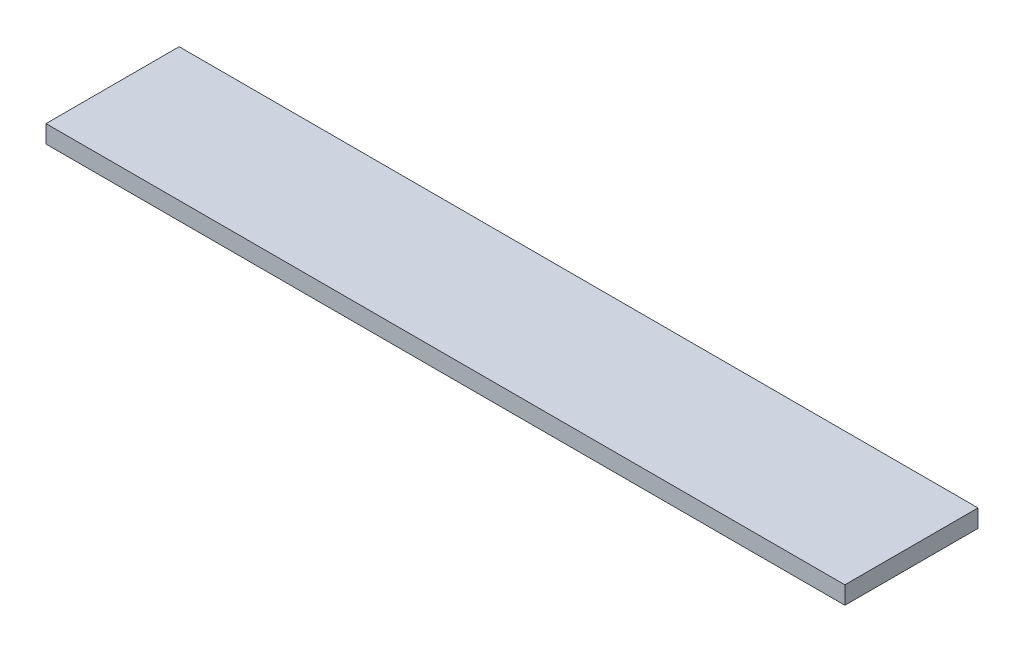
ISO-10303-21;
HEADER;
FILE_DESCRIPTION(('STEP AP214'),'2;1');
FILE_NAME('part.step','',(''),(''),'','','');
FILE_SCHEMA(('AUTOMOTIVE_DESIGN { 1 0 10303 214 1 1 1 1 }'));
ENDSEC;
DATA;
#1=APPLICATION_CONTEXT('core data for automotive mechanical design processes');
#2=APPLICATION_PROTOCOL_DEFINITION('international standard','automotive_design',2000,#1);
#3=PRODUCT_CONTEXT('',#1,'mechanical');
#4=PRODUCT('Part','Part','',(#3));
#5=PRODUCT_RELATED_PRODUCT_CATEGORY('part','',(#4));
#6=PRODUCT_DEFINITION_FORMATION('','',#4);
#7=PRODUCT_DEFINITION_CONTEXT('part definition',#1,'design');
#8=PRODUCT_DEFINITION('design','',#6,#7);
#9=PRODUCT_DEFINITION_SHAPE('','',#8);
#10=(LENGTH_UNIT() NAMED_UNIT(*) SI_UNIT(.MILLI.,.METRE.));
#11=(NAMED_UNIT(*) PLANE_ANGLE_UNIT() SI_UNIT($,.RADIAN.));
#12=(NAMED_UNIT(*) SI_UNIT($,.STERADIAN.) SOLID_ANGLE_UNIT());
#13=UNCERTAINTY_MEASURE_WITH_UNIT(LENGTH_MEASURE(1.E-05),#10,'distance_accuracy_value','');
#14=(GEOMETRIC_REPRESENTATION_CONTEXT(3) GLOBAL_UNCERTAINTY_ASSIGNED_CONTEXT((#13)) GLOBAL_UNIT_ASSIGNED_CONTEXT((#10,
#11,#12)) REPRESENTATION_CONTEXT('',''));
#15=CARTESIAN_POINT('',(0.,0.,0.));
#16=DIRECTION('',(0.,0.,1.));
#17=DIRECTION('',(1.,0.,0.));
#18=AXIS2_PLACEMENT_3D('',#15,#16,#17);
#19=CARTESIAN_POINT('',(90.,1.,7.5));
#20=DIRECTION('',(0.,0.,-1.));
#21=DIRECTION('',(0.,-1.,0.));
#22=AXIS2_PLACEMENT_3D('',#19,#20,#21);
#23=PLANE('',#22);
#24=DIRECTION('',(0.,1.,0.));
#25=VECTOR('',#24,1.);
#26=CARTESIAN_POINT('',(0.,1.,7.5));
#27=LINE('',#26,#25);
#28=CARTESIAN_POINT('',(0.,-1.,7.5));
#29=VERTEX_POINT('',#28);
#30=CARTESIAN_POINT('',(0.,1.,7.5));
#31=VERTEX_POINT('',#30);
#32=EDGE_CURVE('E104',#29,#31,#27,.T.);
#33=ORIENTED_EDGE('',*,*,#32,.F.);
#34=DIRECTION('',(-1.,0.,0.));
#35=VECTOR('',#34,1.);
#36=CARTESIAN_POINT('',(90.,-1.,7.5));
#37=LINE('',#36,#35);
#38=CARTESIAN_POINT('',(90.,-1.,7.5));
#39=VERTEX_POINT('',#38);
#40=EDGE_CURVE('E103',#39,#29,#37,.T.);
#41=ORIENTED_EDGE('',*,*,#40,.F.);
#42=DIRECTION('',(0.,1.,0.));
#43=VECTOR('',#42,1.);
#44=CARTESIAN_POINT('',(90.,1.,7.5));
#45=LINE('',#44,#43);
#46=CARTESIAN_POINT('',(90.,1.,7.5));
#47=VERTEX_POINT('',#46);
#48=EDGE_CURVE('E98',#39,#47,#45,.T.);
#49=ORIENTED_EDGE('',*,*,#48,.T.);
#50=DIRECTION('',(-1.,0.,0.));
#51=VECTOR('',#50,1.);
#52=CARTESIAN_POINT('',(90.,1.,7.5));
#53=LINE('',#52,#51);
#54=EDGE_CURVE('E11',#47,#31,#53,.T.);
#55=ORIENTED_EDGE('',*,*,#54,.T.);
#56=EDGE_LOOP('',(#33,#41,#49,#55));
#57=FACE_BOUND('',#56,.T.);
#58=ADVANCED_FACE('F41',(#57),#23,.F.);
#59=CARTESIAN_POINT('',(90.,1.,-7.5));
#60=DIRECTION('',(0.,-1.,0.));
#61=DIRECTION('',(0.,0.,1.));
#62=AXIS2_PLACEMENT_3D('',#59,#60,#61);
#63=PLANE('',#62);
#64=DIRECTION('',(0.,0.,-1.));
#65=VECTOR('',#64,1.);
#66=CARTESIAN_POINT('',(0.,1.,-7.5));
#67=LINE('',#66,#65);
#68=CARTESIAN_POINT('',(0.,1.,-7.5));
#69=VERTEX_POINT('',#68);
#70=EDGE_CURVE('E106',#31,#69,#67,.T.);
#71=ORIENTED_EDGE('',*,*,#70,.F.);
#72=ORIENTED_EDGE('',*,*,#54,.F.);
#73=DIRECTION('',(0.,0.,-1.));
#74=VECTOR('',#73,1.);
#75=CARTESIAN_POINT('',(90.,1.,-7.5));
#76=LINE('',#75,#74);
#77=CARTESIAN_POINT('',(90.,1.,-7.5));
#78=VERTEX_POINT('',#77);
#79=EDGE_CURVE('E82',#47,#78,#76,.T.);
#80=ORIENTED_EDGE('',*,*,#79,.T.);
#81=DIRECTION('',(-1.,0.,0.));
#82=VECTOR('',#81,1.);
#83=CARTESIAN_POINT('',(90.,1.,-7.5));
#84=LINE('',#83,#82);
#85=EDGE_CURVE('E49',#78,#69,#84,.T.);
#86=ORIENTED_EDGE('',*,*,#85,.T.);
#87=EDGE_LOOP('',(#71,#72,#80,#86));
#88=FACE_BOUND('',#87,.T.);
#89=ADVANCED_FACE('F96',(#88),#63,.F.);
#90=CARTESIAN_POINT('',(90.,1.,-7.5));
#91=DIRECTION('',(0.,0.,1.));
#92=DIRECTION('',(-1.,0.,0.));
#93=AXIS2_PLACEMENT_3D('',#90,#91,#92);
#94=PLANE('',#93);
#95=DIRECTION('',(0.,-1.,0.));
#96=VECTOR('',#95,1.);
#97=CARTESIAN_POINT('',(0.,1.,-7.5));
#98=LINE('',#97,#96);
#99=CARTESIAN_POINT('',(0.,-1.,-7.5));
#100=VERTEX_POINT('',#99);
#101=EDGE_CURVE('E92',#69,#100,#98,.T.);
#102=ORIENTED_EDGE('',*,*,#101,.F.);
#103=ORIENTED_EDGE('',*,*,#85,.F.);
#104=DIRECTION('',(0.,-1.,0.));
#105=VECTOR('',#104,1.);
#106=CARTESIAN_POINT('',(90.,1.,-7.5));
#107=LINE('',#106,#105);
#108=CARTESIAN_POINT('',(90.,-1.,-7.5));
#109=VERTEX_POINT('',#108);
#110=EDGE_CURVE('E85',#78,#109,#107,.T.);
#111=ORIENTED_EDGE('',*,*,#110,.T.);
#112=DIRECTION('',(-1.,0.,0.));
#113=VECTOR('',#112,1.);
#114=CARTESIAN_POINT('',(90.,-1.,-7.5));
#115=LINE('',#114,#113);
#116=EDGE_CURVE('E95',#109,#100,#115,.T.);
#117=ORIENTED_EDGE('',*,*,#116,.T.);
#118=EDGE_LOOP('',(#102,#103,#111,#117));
#119=FACE_BOUND('',#118,.T.);
#120=ADVANCED_FACE('F91',(#119),#94,.F.);
#121=CARTESIAN_POINT('',(90.,-1.,-7.5));
#122=DIRECTION('',(0.,1.,0.));
#123=DIRECTION('',(0.,0.,-1.));
#124=AXIS2_PLACEMENT_3D('',#121,#122,#123);
#125=PLANE('',#124);
#126=DIRECTION('',(0.,0.,1.));
#127=VECTOR('',#126,1.);
#128=CARTESIAN_POINT('',(0.,-1.,-7.5));
#129=LINE('',#128,#127);
#130=EDGE_CURVE('E71',#100,#29,#129,.T.);
#131=ORIENTED_EDGE('',*,*,#130,.F.);
#132=ORIENTED_EDGE('',*,*,#116,.F.);
#133=DIRECTION('',(0.,0.,1.));
#134=VECTOR('',#133,1.);
#135=CARTESIAN_POINT('',(90.,-1.,-7.5));
#136=LINE('',#135,#134);
#137=EDGE_CURVE('E57',#109,#39,#136,.T.);
#138=ORIENTED_EDGE('',*,*,#137,.T.);
#139=ORIENTED_EDGE('',*,*,#40,.T.);
#140=EDGE_LOOP('',(#131,#132,#138,#139));
#141=FACE_BOUND('',#140,.T.);
#142=ADVANCED_FACE('F115',(#141),#125,.F.);
#143=CARTESIAN_POINT('',(90.,0.,0.));
#144=DIRECTION('',(1.,0.,0.));
#145=DIRECTION('',(0.,0.,1.));
#146=AXIS2_PLACEMENT_3D('',#143,#144,#145);
#147=PLANE('',#146);
#148=ORIENTED_EDGE('',*,*,#48,.F.);
#149=ORIENTED_EDGE('',*,*,#137,.F.);
#150=ORIENTED_EDGE('',*,*,#110,.F.);
#151=ORIENTED_EDGE('',*,*,#79,.F.);
#152=EDGE_LOOP('',(#148,#149,#150,#151));
#153=FACE_BOUND('',#152,.T.);
#154=ADVANCED_FACE('F87',(#153),#147,.T.);
#155=CARTESIAN_POINT('',(0.,0.,0.));
#156=DIRECTION('',(1.,0.,0.));
#157=DIRECTION('',(0.,0.,1.));
#158=AXIS2_PLACEMENT_3D('',#155,#156,#157);
#159=PLANE('',#158);
#160=ORIENTED_EDGE('',*,*,#32,.T.);
#161=ORIENTED_EDGE('',*,*,#70,.T.);
#162=ORIENTED_EDGE('',*,*,#101,.T.);
#163=ORIENTED_EDGE('',*,*,#130,.T.);
#164=EDGE_LOOP('',(#160,#161,#162,#163));
#165=FACE_BOUND('',#164,.T.);
#166=ADVANCED_FACE('F111',(#165),#159,.F.);
#167=CLOSED_SHELL('',(#58,#89,#120,#142,#154,#166));
#168=MANIFOLD_SOLID_BREP('B2',#167);
#169=ADVANCED_BREP_SHAPE_REPRESENTATION('',(#18,#168),#14);
#170=SHAPE_DEFINITION_REPRESENTATION(#9,#169);
ENDSEC;
END-ISO-10303-21;
